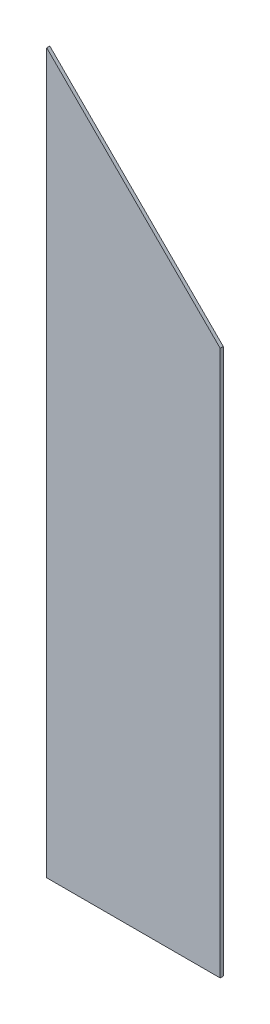
ISO-10303-21;
HEADER;
FILE_DESCRIPTION(('STEP AP214'),'2;1');
FILE_NAME('part.step','',(''),(''),'','','');
FILE_SCHEMA(('AUTOMOTIVE_DESIGN { 1 0 10303 214 1 1 1 1 }'));
ENDSEC;
DATA;
#1=APPLICATION_CONTEXT('core data for automotive mechanical design processes');
#2=APPLICATION_PROTOCOL_DEFINITION('international standard','automotive_design',2000,#1);
#3=PRODUCT_CONTEXT('',#1,'mechanical');
#4=PRODUCT('Part','Part','',(#3));
#5=PRODUCT_RELATED_PRODUCT_CATEGORY('part','',(#4));
#6=PRODUCT_DEFINITION_FORMATION('','',#4);
#7=PRODUCT_DEFINITION_CONTEXT('part definition',#1,'design');
#8=PRODUCT_DEFINITION('design','',#6,#7);
#9=PRODUCT_DEFINITION_SHAPE('','',#8);
#10=(LENGTH_UNIT() NAMED_UNIT(*) SI_UNIT(.MILLI.,.METRE.));
#11=(NAMED_UNIT(*) PLANE_ANGLE_UNIT() SI_UNIT($,.RADIAN.));
#12=(NAMED_UNIT(*) SI_UNIT($,.STERADIAN.) SOLID_ANGLE_UNIT());
#13=UNCERTAINTY_MEASURE_WITH_UNIT(LENGTH_MEASURE(1.E-05),#10,'distance_accuracy_value','');
#14=(GEOMETRIC_REPRESENTATION_CONTEXT(3) GLOBAL_UNCERTAINTY_ASSIGNED_CONTEXT((#13)) GLOBAL_UNIT_ASSIGNED_CONTEXT((#10,
#11,#12)) REPRESENTATION_CONTEXT('',''));
#15=CARTESIAN_POINT('',(0.,0.,0.));
#16=DIRECTION('',(0.,0.,1.));
#17=DIRECTION('',(1.,0.,0.));
#18=AXIS2_PLACEMENT_3D('',#15,#16,#17);
#19=CARTESIAN_POINT('',(0.,0.,3.175));
#20=DIRECTION('',(1.,0.,0.));
#21=DIRECTION('',(0.,0.,-1.));
#22=AXIS2_PLACEMENT_3D('',#19,#20,#21);
#23=PLANE('',#22);
#24=DIRECTION('',(0.,-1.,0.));
#25=VECTOR('',#24,1.);
#26=CARTESIAN_POINT('',(0.,0.,0.));
#27=LINE('',#26,#25);
#28=CARTESIAN_POINT('',(0.,736.6,0.));
#29=VERTEX_POINT('',#28);
#30=CARTESIAN_POINT('',(0.,0.,0.));
#31=VERTEX_POINT('',#30);
#32=EDGE_CURVE('E96',#29,#31,#27,.T.);
#33=ORIENTED_EDGE('',*,*,#32,.T.);
#34=DIRECTION('',(0.,0.,-1.));
#35=VECTOR('',#34,1.);
#36=CARTESIAN_POINT('',(0.,0.,3.175));
#37=LINE('',#36,#35);
#38=CARTESIAN_POINT('',(0.,0.,3.175));
#39=VERTEX_POINT('',#38);
#40=EDGE_CURVE('E11',#39,#31,#37,.T.);
#41=ORIENTED_EDGE('',*,*,#40,.F.);
#42=DIRECTION('',(0.,-1.,0.));
#43=VECTOR('',#42,1.);
#44=CARTESIAN_POINT('',(0.,0.,3.175));
#45=LINE('',#44,#43);
#46=CARTESIAN_POINT('',(0.,736.6,3.175));
#47=VERTEX_POINT('',#46);
#48=EDGE_CURVE('E84',#47,#39,#45,.T.);
#49=ORIENTED_EDGE('',*,*,#48,.F.);
#50=DIRECTION('',(0.,0.,-1.));
#51=VECTOR('',#50,1.);
#52=CARTESIAN_POINT('',(0.,736.6,3.175));
#53=LINE('',#52,#51);
#54=EDGE_CURVE('E92',#47,#29,#53,.T.);
#55=ORIENTED_EDGE('',*,*,#54,.T.);
#56=EDGE_LOOP('',(#33,#41,#49,#55));
#57=FACE_BOUND('',#56,.T.);
#58=ADVANCED_FACE('F33',(#57),#23,.F.);
#59=CARTESIAN_POINT('',(0.,0.,3.175));
#60=DIRECTION('',(0.,1.,0.));
#61=DIRECTION('',(0.,0.,1.));
#62=AXIS2_PLACEMENT_3D('',#59,#60,#61);
#63=PLANE('',#62);
#64=DIRECTION('',(1.,0.,0.));
#65=VECTOR('',#64,1.);
#66=CARTESIAN_POINT('',(0.,0.,0.));
#67=LINE('',#66,#65);
#68=CARTESIAN_POINT('',(177.8,0.,0.));
#69=VERTEX_POINT('',#68);
#70=EDGE_CURVE('E88',#31,#69,#67,.T.);
#71=ORIENTED_EDGE('',*,*,#70,.T.);
#72=DIRECTION('',(0.,0.,-1.));
#73=VECTOR('',#72,1.);
#74=CARTESIAN_POINT('',(177.8,0.,3.175));
#75=LINE('',#74,#73);
#76=CARTESIAN_POINT('',(177.8,0.,3.175));
#77=VERTEX_POINT('',#76);
#78=EDGE_CURVE('E41',#77,#69,#75,.T.);
#79=ORIENTED_EDGE('',*,*,#78,.F.);
#80=DIRECTION('',(1.,0.,0.));
#81=VECTOR('',#80,1.);
#82=CARTESIAN_POINT('',(0.,0.,3.175));
#83=LINE('',#82,#81);
#84=EDGE_CURVE('E79',#39,#77,#83,.T.);
#85=ORIENTED_EDGE('',*,*,#84,.F.);
#86=ORIENTED_EDGE('',*,*,#40,.T.);
#87=EDGE_LOOP('',(#71,#79,#85,#86));
#88=FACE_BOUND('',#87,.T.);
#89=ADVANCED_FACE('F87',(#88),#63,.F.);
#90=CARTESIAN_POINT('',(177.8,0.,3.175));
#91=DIRECTION('',(-1.,0.,0.));
#92=DIRECTION('',(0.,0.,1.));
#93=AXIS2_PLACEMENT_3D('',#90,#91,#92);
#94=PLANE('',#93);
#95=DIRECTION('',(0.,1.,0.));
#96=VECTOR('',#95,1.);
#97=CARTESIAN_POINT('',(177.8,0.,0.));
#98=LINE('',#97,#96);
#99=CARTESIAN_POINT('',(177.8,558.8,0.));
#100=VERTEX_POINT('',#99);
#101=EDGE_CURVE('E66',#69,#100,#98,.T.);
#102=ORIENTED_EDGE('',*,*,#101,.T.);
#103=DIRECTION('',(0.,0.,-1.));
#104=VECTOR('',#103,1.);
#105=CARTESIAN_POINT('',(177.8,558.8,3.175));
#106=LINE('',#105,#104);
#107=CARTESIAN_POINT('',(177.8,558.8,3.175));
#108=VERTEX_POINT('',#107);
#109=EDGE_CURVE('E89',#108,#100,#106,.T.);
#110=ORIENTED_EDGE('',*,*,#109,.F.);
#111=DIRECTION('',(0.,1.,0.));
#112=VECTOR('',#111,1.);
#113=CARTESIAN_POINT('',(177.8,0.,3.175));
#114=LINE('',#113,#112);
#115=EDGE_CURVE('E82',#77,#108,#114,.T.);
#116=ORIENTED_EDGE('',*,*,#115,.F.);
#117=ORIENTED_EDGE('',*,*,#78,.T.);
#118=EDGE_LOOP('',(#102,#110,#116,#117));
#119=FACE_BOUND('',#118,.T.);
#120=ADVANCED_FACE('F90',(#119),#94,.F.);
#121=CARTESIAN_POINT('',(0.,736.6,3.175));
#122=DIRECTION('',(-0.707106781186548,-0.707106781186547,0.));
#123=DIRECTION('',(0.707106781186547,-0.707106781186548,0.));
#124=AXIS2_PLACEMENT_3D('',#121,#122,#123);
#125=PLANE('',#124);
#126=DIRECTION('',(-0.707106781186547,0.707106781186548,0.));
#127=VECTOR('',#126,1.);
#128=CARTESIAN_POINT('',(0.,736.6,0.));
#129=LINE('',#128,#127);
#130=EDGE_CURVE('E72',#100,#29,#129,.T.);
#131=ORIENTED_EDGE('',*,*,#130,.T.);
#132=ORIENTED_EDGE('',*,*,#54,.F.);
#133=DIRECTION('',(-0.707106781186547,0.707106781186548,0.));
#134=VECTOR('',#133,1.);
#135=CARTESIAN_POINT('',(0.,736.6,3.175));
#136=LINE('',#135,#134);
#137=EDGE_CURVE('E49',#108,#47,#136,.T.);
#138=ORIENTED_EDGE('',*,*,#137,.F.);
#139=ORIENTED_EDGE('',*,*,#109,.T.);
#140=EDGE_LOOP('',(#131,#132,#138,#139));
#141=FACE_BOUND('',#140,.T.);
#142=ADVANCED_FACE('F103',(#141),#125,.F.);
#143=CARTESIAN_POINT('',(0.,0.,3.175));
#144=DIRECTION('',(0.,0.,-1.));
#145=DIRECTION('',(-1.,0.,0.));
#146=AXIS2_PLACEMENT_3D('',#143,#144,#145);
#147=PLANE('',#146);
#148=ORIENTED_EDGE('',*,*,#48,.T.);
#149=ORIENTED_EDGE('',*,*,#84,.T.);
#150=ORIENTED_EDGE('',*,*,#115,.T.);
#151=ORIENTED_EDGE('',*,*,#137,.T.);
#152=EDGE_LOOP('',(#148,#149,#150,#151));
#153=FACE_BOUND('',#152,.T.);
#154=ADVANCED_FACE('F80',(#153),#147,.F.);
#155=CARTESIAN_POINT('',(0.,0.,0.));
#156=DIRECTION('',(0.,0.,-1.));
#157=DIRECTION('',(-1.,0.,0.));
#158=AXIS2_PLACEMENT_3D('',#155,#156,#157);
#159=PLANE('',#158);
#160=ORIENTED_EDGE('',*,*,#32,.F.);
#161=ORIENTED_EDGE('',*,*,#130,.F.);
#162=ORIENTED_EDGE('',*,*,#101,.F.);
#163=ORIENTED_EDGE('',*,*,#70,.F.);
#164=EDGE_LOOP('',(#160,#161,#162,#163));
#165=FACE_BOUND('',#164,.T.);
#166=ADVANCED_FACE('F106',(#165),#159,.T.);
#167=CLOSED_SHELL('',(#58,#89,#120,#142,#154,#166));
#168=MANIFOLD_SOLID_BREP('B2',#167);
#169=ADVANCED_BREP_SHAPE_REPRESENTATION('',(#18,#168),#14);
#170=SHAPE_DEFINITION_REPRESENTATION(#9,#169);
ENDSEC;
END-ISO-10303-21;
